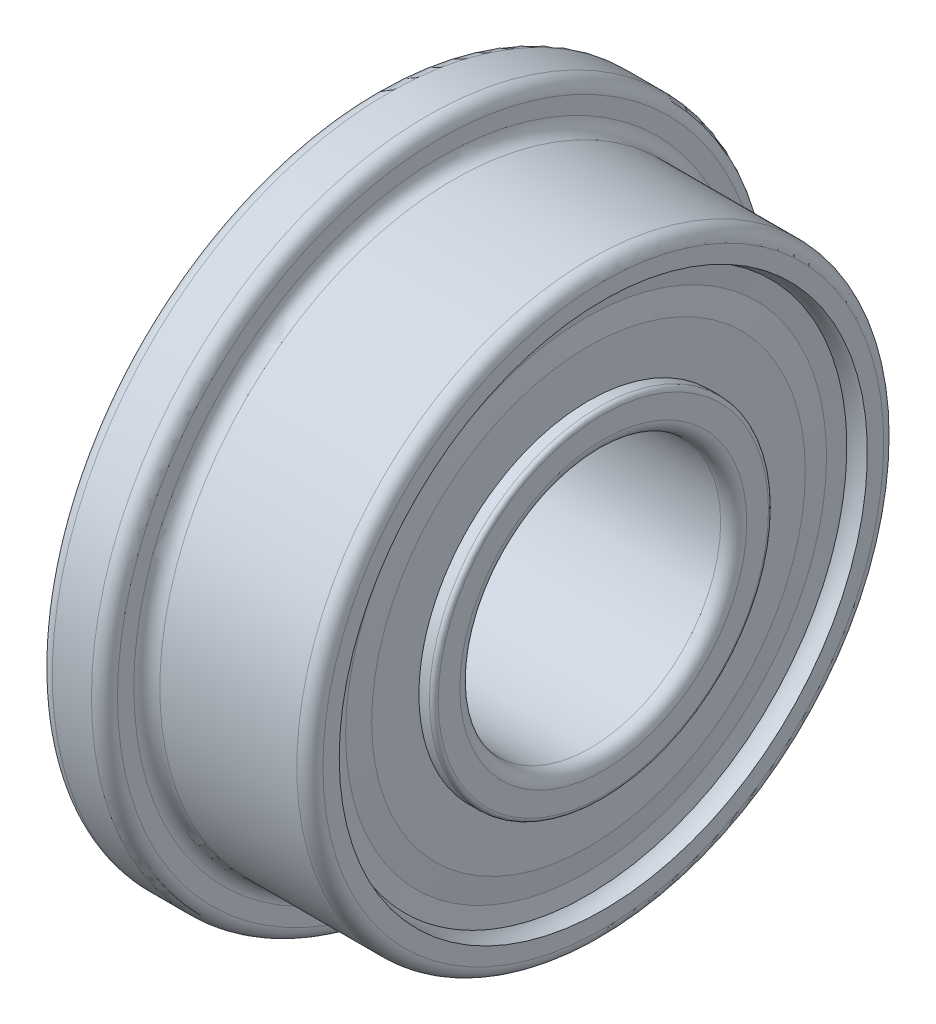
ISO-10303-21;
HEADER;
FILE_DESCRIPTION(('STEP AP214'),'2;1');
FILE_NAME('part.step','',(''),(''),'','','');
FILE_SCHEMA(('AUTOMOTIVE_DESIGN { 1 0 10303 214 1 1 1 1 }'));
ENDSEC;
DATA;
#1=APPLICATION_CONTEXT('core data for automotive mechanical design processes');
#2=APPLICATION_PROTOCOL_DEFINITION('international standard','automotive_design',2000,#1);
#3=PRODUCT_CONTEXT('',#1,'mechanical');
#4=PRODUCT('Part','Part','',(#3));
#5=PRODUCT_RELATED_PRODUCT_CATEGORY('part','',(#4));
#6=PRODUCT_DEFINITION_FORMATION('','',#4);
#7=PRODUCT_DEFINITION_CONTEXT('part definition',#1,'design');
#8=PRODUCT_DEFINITION('design','',#6,#7);
#9=PRODUCT_DEFINITION_SHAPE('','',#8);
#10=(LENGTH_UNIT() NAMED_UNIT(*) SI_UNIT(.MILLI.,.METRE.));
#11=(NAMED_UNIT(*) PLANE_ANGLE_UNIT() SI_UNIT($,.RADIAN.));
#12=(NAMED_UNIT(*) SI_UNIT($,.STERADIAN.) SOLID_ANGLE_UNIT());
#13=UNCERTAINTY_MEASURE_WITH_UNIT(LENGTH_MEASURE(1.E-05),#10,'distance_accuracy_value','');
#14=(GEOMETRIC_REPRESENTATION_CONTEXT(3) GLOBAL_UNCERTAINTY_ASSIGNED_CONTEXT((#13)) GLOBAL_UNIT_ASSIGNED_CONTEXT((#10,
#11,#12)) REPRESENTATION_CONTEXT('',''));
#15=CARTESIAN_POINT('',(0.,0.,0.));
#16=DIRECTION('',(0.,0.,1.));
#17=DIRECTION('',(1.,0.,0.));
#18=AXIS2_PLACEMENT_3D('',#15,#16,#17);
#19=CARTESIAN_POINT('',(1.75,1.97958012090148,-2.48231495683599));
#20=DIRECTION('',(1.,0.,0.));
#21=DIRECTION('',(0.,0.623489801858733,-0.78183148246803));
#22=AXIS2_PLACEMENT_3D('',#19,#20,#21);
#23=SPHERICAL_SURFACE('',#22,0.794);
#24=CARTESIAN_POINT('',(2.544,1.97958012090148,-2.48231495683599));
#25=VERTEX_POINT('',#24);
#26=VERTEX_LOOP('',#25);
#27=FACE_BOUND('',#26,.T.);
#28=CARTESIAN_POINT('',(0.956,1.97958012090148,-2.48231495683599));
#29=VERTEX_POINT('',#28);
#30=VERTEX_LOOP('',#29);
#31=FACE_BOUND('',#30,.T.);
#32=ADVANCED_FACE('P0_F15',(#27,#31),#23,.T.);
#33=CLOSED_SHELL('',(#32));
#34=MANIFOLD_SOLID_BREP('P0_B1',#33);
#35=CARTESIAN_POINT('',(1.75,0.,0.));
#36=DIRECTION('',(-1.,0.,0.));
#37=DIRECTION('',(0.,0.,1.));
#38=AXIS2_PLACEMENT_3D('',#35,#36,#37);
#39=TOROIDAL_SURFACE('',#38,3.175,0.794);
#40=CARTESIAN_POINT('',(1.2024500022829,0.,0.));
#41=DIRECTION('',(1.,0.,0.));
#42=DIRECTION('',(0.,0.,-1.));
#43=AXIS2_PLACEMENT_3D('',#40,#41,#42);
#44=CIRCLE('',#43,2.6);
#45=CARTESIAN_POINT('',(1.2024500022829,0.,-2.6));
#46=VERTEX_POINT('',#45);
#47=EDGE_CURVE('P1_E129',#46,#46,#44,.F.);
#48=ORIENTED_EDGE('',*,*,#47,.F.);
#49=EDGE_LOOP('',(#48));
#50=FACE_BOUND('',#49,.T.);
#51=CARTESIAN_POINT('',(2.2975499977171,0.,0.));
#52=DIRECTION('',(1.,0.,0.));
#53=DIRECTION('',(0.,0.,-1.));
#54=AXIS2_PLACEMENT_3D('',#51,#52,#53);
#55=CIRCLE('',#54,2.6);
#56=CARTESIAN_POINT('',(2.2975499977171,0.,-2.6));
#57=VERTEX_POINT('',#56);
#58=EDGE_CURVE('P1_E124',#57,#57,#55,.T.);
#59=ORIENTED_EDGE('',*,*,#58,.F.);
#60=EDGE_LOOP('',(#59));
#61=FACE_BOUND('',#60,.T.);
#62=ADVANCED_FACE('P1_F16',(#50,#61),#39,.F.);
#63=CARTESIAN_POINT('',(0.634725001141448,0.,0.));
#64=DIRECTION('',(1.,0.,0.));
#65=DIRECTION('',(0.,0.,-1.));
#66=AXIS2_PLACEMENT_3D('',#63,#64,#65);
#67=CYLINDRICAL_SURFACE('',#66,2.6);
#68=ORIENTED_EDGE('',*,*,#47,.T.);
#69=EDGE_LOOP('',(#68));
#70=FACE_BOUND('',#69,.T.);
#71=CARTESIAN_POINT('',(0.0670000000000001,0.,0.));
#72=DIRECTION('',(-1.,0.,0.));
#73=DIRECTION('',(0.,0.,1.));
#74=AXIS2_PLACEMENT_3D('',#71,#72,#73);
#75=CIRCLE('',#74,2.6);
#76=CARTESIAN_POINT('',(0.0670000000000001,0.,2.6));
#77=VERTEX_POINT('',#76);
#78=EDGE_CURVE('P1_E122',#77,#77,#75,.T.);
#79=ORIENTED_EDGE('',*,*,#78,.F.);
#80=EDGE_LOOP('',(#79));
#81=FACE_BOUND('',#80,.T.);
#82=ADVANCED_FACE('P1_F358',(#70,#81),#67,.T.);
#83=CARTESIAN_POINT('',(2.86527499885855,0.,0.));
#84=DIRECTION('',(1.,0.,0.));
#85=DIRECTION('',(0.,0.,-1.));
#86=AXIS2_PLACEMENT_3D('',#83,#84,#85);
#87=CYLINDRICAL_SURFACE('',#86,2.6);
#88=CARTESIAN_POINT('',(3.433,0.,0.));
#89=DIRECTION('',(-1.,0.,0.));
#90=DIRECTION('',(0.,0.,1.));
#91=AXIS2_PLACEMENT_3D('',#88,#89,#90);
#92=CIRCLE('',#91,2.6);
#93=CARTESIAN_POINT('',(3.433,0.,2.6));
#94=VERTEX_POINT('',#93);
#95=EDGE_CURVE('P1_E114',#94,#94,#92,.F.);
#96=ORIENTED_EDGE('',*,*,#95,.F.);
#97=EDGE_LOOP('',(#96));
#98=FACE_BOUND('',#97,.T.);
#99=ORIENTED_EDGE('',*,*,#58,.T.);
#100=EDGE_LOOP('',(#99));
#101=FACE_BOUND('',#100,.T.);
#102=ADVANCED_FACE('P1_F104',(#98,#101),#87,.T.);
#103=CARTESIAN_POINT('',(0.0670000000000001,0.,0.));
#104=DIRECTION('',(-1.,0.,0.));
#105=DIRECTION('',(0.,0.,1.));
#106=AXIS2_PLACEMENT_3D('',#103,#104,#105);
#107=TOROIDAL_SURFACE('',#106,2.533,0.0670000000000002);
#108=ORIENTED_EDGE('',*,*,#78,.T.);
#109=EDGE_LOOP('',(#108));
#110=FACE_BOUND('',#109,.T.);
#111=CARTESIAN_POINT('',(0.,0.,0.));
#112=DIRECTION('',(1.,0.,0.));
#113=DIRECTION('',(0.,0.,-1.));
#114=AXIS2_PLACEMENT_3D('',#111,#112,#113);
#115=CIRCLE('',#114,2.533);
#116=CARTESIAN_POINT('',(0.,2.533,0.));
#117=VERTEX_POINT('',#116);
#118=CARTESIAN_POINT('',(0.,0.,-2.533));
#119=VERTEX_POINT('',#118);
#120=EDGE_CURVE('P1_E70',#117,#119,#115,.F.);
#121=ORIENTED_EDGE('',*,*,#120,.F.);
#122=CARTESIAN_POINT('',(0.,0.,0.));
#123=DIRECTION('',(1.,0.,0.));
#124=DIRECTION('',(0.,1.,0.));
#125=AXIS2_PLACEMENT_3D('',#122,#123,#124);
#126=CIRCLE('',#125,2.533);
#127=CARTESIAN_POINT('',(0.,0.,2.533));
#128=VERTEX_POINT('',#127);
#129=EDGE_CURVE('P1_E78',#128,#117,#126,.F.);
#130=ORIENTED_EDGE('',*,*,#129,.F.);
#131=CARTESIAN_POINT('',(0.,0.,0.));
#132=DIRECTION('',(1.,0.,0.));
#133=DIRECTION('',(0.,0.,1.));
#134=AXIS2_PLACEMENT_3D('',#131,#132,#133);
#135=CIRCLE('',#134,2.533);
#136=EDGE_CURVE('P1_E73',#119,#128,#135,.F.);
#137=ORIENTED_EDGE('',*,*,#136,.F.);
#138=EDGE_LOOP('',(#121,#130,#137));
#139=FACE_BOUND('',#138,.T.);
#140=ADVANCED_FACE('P1_F84',(#110,#139),#107,.T.);
#141=CARTESIAN_POINT('',(3.433,0.,0.));
#142=DIRECTION('',(-1.,0.,0.));
#143=DIRECTION('',(0.,0.,1.));
#144=AXIS2_PLACEMENT_3D('',#141,#142,#143);
#145=TOROIDAL_SURFACE('',#144,2.533,0.0670000000000002);
#146=ORIENTED_EDGE('',*,*,#95,.T.);
#147=EDGE_LOOP('',(#146));
#148=FACE_BOUND('',#147,.T.);
#149=CARTESIAN_POINT('',(3.5,0.,0.));
#150=DIRECTION('',(-1.,0.,0.));
#151=DIRECTION('',(0.,0.,-1.));
#152=AXIS2_PLACEMENT_3D('',#149,#150,#151);
#153=CIRCLE('',#152,2.533);
#154=CARTESIAN_POINT('',(3.5,0.,2.533));
#155=VERTEX_POINT('',#154);
#156=CARTESIAN_POINT('',(3.5,0.,-2.533));
#157=VERTEX_POINT('',#156);
#158=EDGE_CURVE('P1_E273',#155,#157,#153,.F.);
#159=ORIENTED_EDGE('',*,*,#158,.F.);
#160=CARTESIAN_POINT('',(3.5,0.,0.));
#161=DIRECTION('',(-1.,0.,0.));
#162=DIRECTION('',(0.,0.,1.));
#163=AXIS2_PLACEMENT_3D('',#160,#161,#162);
#164=CIRCLE('',#163,2.533);
#165=CARTESIAN_POINT('',(3.5,2.533,0.));
#166=VERTEX_POINT('',#165);
#167=EDGE_CURVE('P1_E274',#166,#155,#164,.F.);
#168=ORIENTED_EDGE('',*,*,#167,.F.);
#169=CARTESIAN_POINT('',(3.5,0.,0.));
#170=DIRECTION('',(-1.,0.,0.));
#171=DIRECTION('',(0.,1.,0.));
#172=AXIS2_PLACEMENT_3D('',#169,#170,#171);
#173=CIRCLE('',#172,2.533);
#174=EDGE_CURVE('P1_E86',#157,#166,#173,.F.);
#175=ORIENTED_EDGE('',*,*,#174,.F.);
#176=EDGE_LOOP('',(#159,#168,#175));
#177=FACE_BOUND('',#176,.T.);
#178=ADVANCED_FACE('P1_F103',(#148,#177),#145,.T.);
#179=CARTESIAN_POINT('',(0.,2.3665,0.));
#180=DIRECTION('',(-1.,0.,0.));
#181=DIRECTION('',(0.,-1.,0.));
#182=AXIS2_PLACEMENT_3D('',#179,#180,#181);
#183=PLANE('',#182);
#184=ORIENTED_EDGE('',*,*,#136,.T.);
#185=ORIENTED_EDGE('',*,*,#129,.T.);
#186=ORIENTED_EDGE('',*,*,#120,.T.);
#187=EDGE_LOOP('',(#184,#185,#186));
#188=FACE_BOUND('',#187,.T.);
#189=CARTESIAN_POINT('',(0.,0.,0.));
#190=DIRECTION('',(-1.,0.,0.));
#191=DIRECTION('',(0.,0.,1.));
#192=AXIS2_PLACEMENT_3D('',#189,#190,#191);
#193=CIRCLE('',#192,2.2);
#194=CARTESIAN_POINT('',(0.,0.,2.2));
#195=VERTEX_POINT('',#194);
#196=CARTESIAN_POINT('',(0.,2.2,0.));
#197=VERTEX_POINT('',#196);
#198=EDGE_CURVE('P1_E244',#195,#197,#193,.T.);
#199=ORIENTED_EDGE('',*,*,#198,.F.);
#200=CARTESIAN_POINT('',(0.,0.,0.));
#201=DIRECTION('',(-1.,0.,0.));
#202=DIRECTION('',(0.,0.,-1.));
#203=AXIS2_PLACEMENT_3D('',#200,#201,#202);
#204=CIRCLE('',#203,2.2);
#205=CARTESIAN_POINT('',(0.,0.,-2.2));
#206=VERTEX_POINT('',#205);
#207=EDGE_CURVE('P1_E255',#206,#195,#204,.T.);
#208=ORIENTED_EDGE('',*,*,#207,.F.);
#209=CARTESIAN_POINT('',(0.,0.,0.));
#210=DIRECTION('',(-1.,0.,0.));
#211=DIRECTION('',(0.,1.,0.));
#212=AXIS2_PLACEMENT_3D('',#209,#210,#211);
#213=CIRCLE('',#212,2.2);
#214=EDGE_CURVE('P1_E234',#197,#206,#213,.T.);
#215=ORIENTED_EDGE('',*,*,#214,.F.);
#216=EDGE_LOOP('',(#199,#208,#215));
#217=FACE_BOUND('',#216,.T.);
#218=ADVANCED_FACE('P1_F76',(#188,#217),#183,.T.);
#219=CARTESIAN_POINT('',(3.5,2.3665,0.));
#220=DIRECTION('',(1.,0.,0.));
#221=DIRECTION('',(0.,1.,0.));
#222=AXIS2_PLACEMENT_3D('',#219,#220,#221);
#223=PLANE('',#222);
#224=CARTESIAN_POINT('',(3.5,0.,0.));
#225=DIRECTION('',(1.,0.,0.));
#226=DIRECTION('',(0.,0.,1.));
#227=AXIS2_PLACEMENT_3D('',#224,#225,#226);
#228=CIRCLE('',#227,2.2);
#229=CARTESIAN_POINT('',(3.5,0.,2.2));
#230=VERTEX_POINT('',#229);
#231=CARTESIAN_POINT('',(3.5,0.,-2.2));
#232=VERTEX_POINT('',#231);
#233=EDGE_CURVE('P1_E133',#230,#232,#228,.T.);
#234=ORIENTED_EDGE('',*,*,#233,.F.);
#235=CARTESIAN_POINT('',(3.5,0.,0.));
#236=DIRECTION('',(1.,0.,0.));
#237=DIRECTION('',(0.,1.,0.));
#238=AXIS2_PLACEMENT_3D('',#235,#236,#237);
#239=CIRCLE('',#238,2.2);
#240=CARTESIAN_POINT('',(3.5,2.2,0.));
#241=VERTEX_POINT('',#240);
#242=EDGE_CURVE('P1_E206',#241,#230,#239,.T.);
#243=ORIENTED_EDGE('',*,*,#242,.F.);
#244=CARTESIAN_POINT('',(3.5,0.,0.));
#245=DIRECTION('',(1.,0.,0.));
#246=DIRECTION('',(0.,0.,-1.));
#247=AXIS2_PLACEMENT_3D('',#244,#245,#246);
#248=CIRCLE('',#247,2.2);
#249=EDGE_CURVE('P1_E37',#232,#241,#248,.T.);
#250=ORIENTED_EDGE('',*,*,#249,.F.);
#251=EDGE_LOOP('',(#234,#243,#250));
#252=FACE_BOUND('',#251,.T.);
#253=ORIENTED_EDGE('',*,*,#167,.T.);
#254=ORIENTED_EDGE('',*,*,#158,.T.);
#255=ORIENTED_EDGE('',*,*,#174,.T.);
#256=EDGE_LOOP('',(#253,#254,#255));
#257=FACE_BOUND('',#256,.T.);
#258=ADVANCED_FACE('P1_F170',(#252,#257),#223,.T.);
#259=CARTESIAN_POINT('',(0.2,0.,0.));
#260=DIRECTION('',(-1.,0.,0.));
#261=DIRECTION('',(0.,0.,1.));
#262=AXIS2_PLACEMENT_3D('',#259,#260,#261);
#263=TOROIDAL_SURFACE('',#262,2.2,0.2);
#264=CARTESIAN_POINT('',(0.2,0.,0.));
#265=DIRECTION('',(1.,0.,0.));
#266=DIRECTION('',(0.,0.,-1.));
#267=AXIS2_PLACEMENT_3D('',#264,#265,#266);
#268=CIRCLE('',#267,2.);
#269=CARTESIAN_POINT('',(0.2,0.,-2.));
#270=VERTEX_POINT('',#269);
#271=EDGE_CURVE('P1_E28',#270,#270,#268,.T.);
#272=ORIENTED_EDGE('',*,*,#271,.T.);
#273=EDGE_LOOP('',(#272));
#274=FACE_BOUND('',#273,.T.);
#275=ORIENTED_EDGE('',*,*,#207,.T.);
#276=ORIENTED_EDGE('',*,*,#198,.T.);
#277=ORIENTED_EDGE('',*,*,#214,.T.);
#278=EDGE_LOOP('',(#275,#276,#277));
#279=FACE_BOUND('',#278,.T.);
#280=ADVANCED_FACE('P1_F151',(#274,#279),#263,.T.);
#281=CARTESIAN_POINT('',(3.3,0.,0.));
#282=DIRECTION('',(-1.,0.,0.));
#283=DIRECTION('',(0.,0.,1.));
#284=AXIS2_PLACEMENT_3D('',#281,#282,#283);
#285=TOROIDAL_SURFACE('',#284,2.2,0.2);
#286=CARTESIAN_POINT('',(3.3,0.,0.));
#287=DIRECTION('',(1.,0.,0.));
#288=DIRECTION('',(0.,0.,-1.));
#289=AXIS2_PLACEMENT_3D('',#286,#287,#288);
#290=CIRCLE('',#289,2.);
#291=CARTESIAN_POINT('',(3.3,0.,-2.));
#292=VERTEX_POINT('',#291);
#293=EDGE_CURVE('P1_E11',#292,#292,#290,.F.);
#294=ORIENTED_EDGE('',*,*,#293,.T.);
#295=EDGE_LOOP('',(#294));
#296=FACE_BOUND('',#295,.T.);
#297=ORIENTED_EDGE('',*,*,#249,.T.);
#298=ORIENTED_EDGE('',*,*,#242,.T.);
#299=ORIENTED_EDGE('',*,*,#233,.T.);
#300=EDGE_LOOP('',(#297,#298,#299));
#301=FACE_BOUND('',#300,.T.);
#302=ADVANCED_FACE('P1_F139',(#296,#301),#285,.T.);
#303=CARTESIAN_POINT('',(1.75,0.,0.));
#304=DIRECTION('',(1.,0.,0.));
#305=DIRECTION('',(0.,0.,-1.));
#306=AXIS2_PLACEMENT_3D('',#303,#304,#305);
#307=CYLINDRICAL_SURFACE('',#306,2.);
#308=ORIENTED_EDGE('',*,*,#293,.F.);
#309=EDGE_LOOP('',(#308));
#310=FACE_BOUND('',#309,.T.);
#311=ORIENTED_EDGE('',*,*,#271,.F.);
#312=EDGE_LOOP('',(#311));
#313=FACE_BOUND('',#312,.T.);
#314=ADVANCED_FACE('P1_F150',(#310,#313),#307,.F.);
#315=CLOSED_SHELL('',(#62,#82,#102,#140,#178,#218,#258,#280,#302,#314));
#316=MANIFOLD_SOLID_BREP('P1_B1',#315);
#317=CARTESIAN_POINT('',(0.302499999989436,0.,0.));
#318=DIRECTION('',(-1.,0.,0.));
#319=DIRECTION('',(0.,0.,1.));
#320=AXIS2_PLACEMENT_3D('',#317,#318,#319);
#321=CONICAL_SURFACE('',#320,4.05000000006339,1.37175391078244);
#322=CARTESIAN_POINT('',(0.3025,0.,0.));
#323=DIRECTION('',(1.,0.,0.));
#324=DIRECTION('',(0.,0.,-1.));
#325=AXIS2_PLACEMENT_3D('',#322,#323,#324);
#326=CIRCLE('',#325,4.05);
#327=CARTESIAN_POINT('',(0.3025,0.,-4.05));
#328=VERTEX_POINT('',#327);
#329=EDGE_CURVE('P2_E29',#328,#328,#326,.F.);
#330=ORIENTED_EDGE('',*,*,#329,.F.);
#331=EDGE_LOOP('',(#330));
#332=FACE_BOUND('',#331,.T.);
#333=CARTESIAN_POINT('',(0.378000000009235,0.,0.));
#334=DIRECTION('',(-1.,0.,0.));
#335=DIRECTION('',(0.,0.,1.));
#336=AXIS2_PLACEMENT_3D('',#333,#334,#335);
#337=CIRCLE('',#336,3.67570637928338);
#338=CARTESIAN_POINT('',(0.378000000009235,0.,3.67570637928338));
#339=VERTEX_POINT('',#338);
#340=EDGE_CURVE('P2_E17',#339,#339,#337,.F.);
#341=ORIENTED_EDGE('',*,*,#340,.F.);
#342=EDGE_LOOP('',(#341));
#343=FACE_BOUND('',#342,.T.);
#344=ADVANCED_FACE('P2_F14',(#332,#343),#321,.T.);
#345=CARTESIAN_POINT('',(0.378,3.50035318965517,0.));
#346=DIRECTION('',(1.,0.,0.));
#347=DIRECTION('',(0.,0.,-1.));
#348=AXIS2_PLACEMENT_3D('',#345,#346,#347);
#349=PLANE('',#348);
#350=CARTESIAN_POINT('',(0.377999999994211,0.,0.));
#351=DIRECTION('',(1.,0.,0.));
#352=DIRECTION('',(0.,0.,-1.));
#353=AXIS2_PLACEMENT_3D('',#350,#351,#352);
#354=CIRCLE('',#353,3.32500000001801);
#355=CARTESIAN_POINT('',(0.377999999994211,0.,-3.32500000001801));
#356=VERTEX_POINT('',#355);
#357=EDGE_CURVE('P2_E31',#356,#356,#354,.F.);
#358=ORIENTED_EDGE('',*,*,#357,.T.);
#359=EDGE_LOOP('',(#358));
#360=FACE_BOUND('',#359,.T.);
#361=ORIENTED_EDGE('',*,*,#340,.T.);
#362=EDGE_LOOP('',(#361));
#363=FACE_BOUND('',#362,.T.);
#364=ADVANCED_FACE('P2_F44',(#360,#363),#349,.T.);
#365=CARTESIAN_POINT('',(0.26475,0.,0.));
#366=DIRECTION('',(1.,0.,0.));
#367=DIRECTION('',(0.,0.,-1.));
#368=AXIS2_PLACEMENT_3D('',#365,#366,#367);
#369=CYLINDRICAL_SURFACE('',#368,4.05);
#370=CARTESIAN_POINT('',(0.226999999995314,0.,0.));
#371=DIRECTION('',(-1.,0.,0.));
#372=DIRECTION('',(0.,1.,0.));
#373=AXIS2_PLACEMENT_3D('',#370,#371,#372);
#374=CIRCLE('',#373,4.05000000000655);
#375=CARTESIAN_POINT('',(0.226999999995314,4.05000000000655,0.));
#376=VERTEX_POINT('',#375);
#377=EDGE_CURVE('P2_E33',#376,#376,#374,.F.);
#378=ORIENTED_EDGE('',*,*,#377,.T.);
#379=EDGE_LOOP('',(#378));
#380=FACE_BOUND('',#379,.T.);
#381=ORIENTED_EDGE('',*,*,#329,.T.);
#382=EDGE_LOOP('',(#381));
#383=FACE_BOUND('',#382,.T.);
#384=ADVANCED_FACE('P2_F52',(#380,#383),#369,.T.);
#385=CARTESIAN_POINT('',(0.377999999976453,0.,0.));
#386=DIRECTION('',(1.,0.,0.));
#387=DIRECTION('',(0.,0.,-1.));
#388=AXIS2_PLACEMENT_3D('',#385,#386,#387);
#389=CONICAL_SURFACE('',#388,3.32499999984748,1.46703241359791);
#390=ORIENTED_EDGE('',*,*,#357,.F.);
#391=EDGE_LOOP('',(#390));
#392=FACE_BOUND('',#391,.T.);
#393=CARTESIAN_POINT('',(0.3025,0.,0.));
#394=DIRECTION('',(1.,0.,0.));
#395=DIRECTION('',(0.,0.,-1.));
#396=AXIS2_PLACEMENT_3D('',#393,#394,#395);
#397=CIRCLE('',#396,2.6);
#398=CARTESIAN_POINT('',(0.3025,0.,-2.6));
#399=VERTEX_POINT('',#398);
#400=EDGE_CURVE('P2_E37',#399,#399,#397,.F.);
#401=ORIENTED_EDGE('',*,*,#400,.T.);
#402=EDGE_LOOP('',(#401));
#403=FACE_BOUND('',#402,.T.);
#404=ADVANCED_FACE('P2_F71',(#392,#403),#389,.F.);
#405=CARTESIAN_POINT('',(0.227000000016631,0.,0.));
#406=DIRECTION('',(-1.,0.,0.));
#407=DIRECTION('',(0.,0.,1.));
#408=AXIS2_PLACEMENT_3D('',#405,#406,#407);
#409=CONICAL_SURFACE('',#408,4.04999999983602,1.46703241360275);
#410=CARTESIAN_POINT('',(0.264749999992375,0.,0.));
#411=DIRECTION('',(1.,0.,0.));
#412=DIRECTION('',(0.,1.,0.));
#413=AXIS2_PLACEMENT_3D('',#410,#411,#412);
#414=CIRCLE('',#413,3.68750000001228);
#415=CARTESIAN_POINT('',(0.264749999992375,3.68750000001228,0.));
#416=VERTEX_POINT('',#415);
#417=EDGE_CURVE('P2_E26',#416,#416,#414,.F.);
#418=ORIENTED_EDGE('',*,*,#417,.F.);
#419=EDGE_LOOP('',(#418));
#420=FACE_BOUND('',#419,.T.);
#421=ORIENTED_EDGE('',*,*,#377,.F.);
#422=EDGE_LOOP('',(#421));
#423=FACE_BOUND('',#422,.T.);
#424=ADVANCED_FACE('P2_F67',(#420,#423),#409,.F.);
#425=CARTESIAN_POINT('',(0.26475,0.,0.));
#426=DIRECTION('',(1.,0.,0.));
#427=DIRECTION('',(0.,0.,-1.));
#428=AXIS2_PLACEMENT_3D('',#425,#426,#427);
#429=CYLINDRICAL_SURFACE('',#428,2.6);
#430=ORIENTED_EDGE('',*,*,#400,.F.);
#431=EDGE_LOOP('',(#430));
#432=FACE_BOUND('',#431,.T.);
#433=CARTESIAN_POINT('',(0.227,0.,0.));
#434=DIRECTION('',(1.,0.,0.));
#435=DIRECTION('',(0.,0.,-1.));
#436=AXIS2_PLACEMENT_3D('',#433,#434,#435);
#437=CIRCLE('',#436,2.6);
#438=CARTESIAN_POINT('',(0.227,0.,-2.6));
#439=VERTEX_POINT('',#438);
#440=EDGE_CURVE('P2_E21',#439,#439,#437,.T.);
#441=ORIENTED_EDGE('',*,*,#440,.F.);
#442=EDGE_LOOP('',(#441));
#443=FACE_BOUND('',#442,.T.);
#444=ADVANCED_FACE('P2_F60',(#432,#443),#429,.F.);
#445=CARTESIAN_POINT('',(0.264749999971059,0.,0.));
#446=DIRECTION('',(1.,0.,0.));
#447=DIRECTION('',(0.,0.,-1.));
#448=AXIS2_PLACEMENT_3D('',#445,#446,#447);
#449=CONICAL_SURFACE('',#448,3.6874999997849,1.46703241360922);
#450=CARTESIAN_POINT('',(0.226999999998862,0.,0.));
#451=DIRECTION('',(1.,0.,0.));
#452=DIRECTION('',(0.,0.,-1.));
#453=AXIS2_PLACEMENT_3D('',#450,#451,#452);
#454=CIRCLE('',#453,3.32500000001801);
#455=CARTESIAN_POINT('',(0.226999999998862,0.,-3.32500000001801));
#456=VERTEX_POINT('',#455);
#457=EDGE_CURVE('P2_E10',#456,#456,#454,.F.);
#458=ORIENTED_EDGE('',*,*,#457,.F.);
#459=EDGE_LOOP('',(#458));
#460=FACE_BOUND('',#459,.T.);
#461=ORIENTED_EDGE('',*,*,#417,.T.);
#462=EDGE_LOOP('',(#461));
#463=FACE_BOUND('',#462,.T.);
#464=ADVANCED_FACE('P2_F55',(#460,#463),#449,.T.);
#465=CARTESIAN_POINT('',(0.227,2.9625,0.));
#466=DIRECTION('',(-1.,0.,0.));
#467=DIRECTION('',(0.,0.,1.));
#468=AXIS2_PLACEMENT_3D('',#465,#466,#467);
#469=PLANE('',#468);
#470=ORIENTED_EDGE('',*,*,#457,.T.);
#471=EDGE_LOOP('',(#470));
#472=FACE_BOUND('',#471,.T.);
#473=ORIENTED_EDGE('',*,*,#440,.T.);
#474=EDGE_LOOP('',(#473));
#475=FACE_BOUND('',#474,.T.);
#476=ADVANCED_FACE('P2_F53',(#472,#475),#469,.T.);
#477=CLOSED_SHELL('',(#344,#364,#384,#404,#424,#444,#464,#476));
#478=MANIFOLD_SOLID_BREP('P2_B1',#477);
#479=CARTESIAN_POINT('',(1.75,-0.706503965311296,3.09539612117729));
#480=DIRECTION('',(1.,0.,0.));
#481=DIRECTION('',(0.,-0.222520933956314,0.974927912181824));
#482=AXIS2_PLACEMENT_3D('',#479,#480,#481);
#483=SPHERICAL_SURFACE('',#482,0.794);
#484=CARTESIAN_POINT('',(2.544,-0.706503965311296,3.09539612117729));
#485=VERTEX_POINT('',#484);
#486=VERTEX_LOOP('',#485);
#487=FACE_BOUND('',#486,.T.);
#488=CARTESIAN_POINT('',(0.956,-0.706503965311296,3.09539612117729));
#489=VERTEX_POINT('',#488);
#490=VERTEX_LOOP('',#489);
#491=FACE_BOUND('',#490,.T.);
#492=ADVANCED_FACE('P3_F15',(#487,#491),#483,.T.);
#493=CLOSED_SHELL('',(#492));
#494=MANIFOLD_SOLID_BREP('P3_B1',#493);
#495=CARTESIAN_POINT('',(1.75,1.97958012090148,2.482314956836));
#496=DIRECTION('',(1.,0.,0.));
#497=DIRECTION('',(0.,0.623489801858733,0.78183148246803));
#498=AXIS2_PLACEMENT_3D('',#495,#496,#497);
#499=SPHERICAL_SURFACE('',#498,0.794);
#500=CARTESIAN_POINT('',(2.544,1.97958012090148,2.482314956836));
#501=VERTEX_POINT('',#500);
#502=VERTEX_LOOP('',#501);
#503=FACE_BOUND('',#502,.T.);
#504=CARTESIAN_POINT('',(0.956,1.97958012090148,2.482314956836));
#505=VERTEX_POINT('',#504);
#506=VERTEX_LOOP('',#505);
#507=FACE_BOUND('',#506,.T.);
#508=ADVANCED_FACE('P4_F15',(#503,#507),#499,.T.);
#509=CLOSED_SHELL('',(#508));
#510=MANIFOLD_SOLID_BREP('P4_B1',#509);
#511=CARTESIAN_POINT('',(1.75,-2.86057615559018,1.37758087169825));
#512=DIRECTION('',(1.,0.,0.));
#513=DIRECTION('',(0.,-0.900968867902419,0.433883739117558));
#514=AXIS2_PLACEMENT_3D('',#511,#512,#513);
#515=SPHERICAL_SURFACE('',#514,0.794);
#516=CARTESIAN_POINT('',(2.544,-2.86057615559018,1.37758087169825));
#517=VERTEX_POINT('',#516);
#518=VERTEX_LOOP('',#517);
#519=FACE_BOUND('',#518,.T.);
#520=CARTESIAN_POINT('',(0.956,-2.86057615559018,1.37758087169825));
#521=VERTEX_POINT('',#520);
#522=VERTEX_LOOP('',#521);
#523=FACE_BOUND('',#522,.T.);
#524=ADVANCED_FACE('P5_F15',(#519,#523),#515,.T.);
#525=CLOSED_SHELL('',(#524));
#526=MANIFOLD_SOLID_BREP('P5_B1',#525);
#527=CARTESIAN_POINT('',(1.75,-0.706503965311298,-3.09539612117729));
#528=DIRECTION('',(1.,0.,0.));
#529=DIRECTION('',(0.,-0.222520933956314,-0.974927912181824));
#530=AXIS2_PLACEMENT_3D('',#527,#528,#529);
#531=SPHERICAL_SURFACE('',#530,0.794);
#532=CARTESIAN_POINT('',(2.544,-0.706503965311298,-3.09539612117729));
#533=VERTEX_POINT('',#532);
#534=VERTEX_LOOP('',#533);
#535=FACE_BOUND('',#534,.T.);
#536=CARTESIAN_POINT('',(0.956,-0.706503965311298,-3.09539612117729));
#537=VERTEX_POINT('',#536);
#538=VERTEX_LOOP('',#537);
#539=FACE_BOUND('',#538,.T.);
#540=ADVANCED_FACE('P6_F15',(#535,#539),#531,.T.);
#541=CLOSED_SHELL('',(#540));
#542=MANIFOLD_SOLID_BREP('P6_B1',#541);
#543=CARTESIAN_POINT('',(3.19749999999885,0.,0.));
#544=DIRECTION('',(1.,0.,0.));
#545=DIRECTION('',(0.,0.,-1.));
#546=AXIS2_PLACEMENT_3D('',#543,#544,#545);
#547=CONICAL_SURFACE('',#546,4.05000000006339,1.37175391078244);
#548=CARTESIAN_POINT('',(3.12199999997906,0.,0.));
#549=DIRECTION('',(1.,0.,0.));
#550=DIRECTION('',(0.,0.,-1.));
#551=AXIS2_PLACEMENT_3D('',#548,#549,#550);
#552=CIRCLE('',#551,3.67570637928338);
#553=CARTESIAN_POINT('',(3.12199999997906,0.,-3.67570637928338));
#554=VERTEX_POINT('',#553);
#555=EDGE_CURVE('P7_E17',#554,#554,#552,.F.);
#556=ORIENTED_EDGE('',*,*,#555,.F.);
#557=EDGE_LOOP('',(#556));
#558=FACE_BOUND('',#557,.T.);
#559=CARTESIAN_POINT('',(3.1975,0.,0.));
#560=DIRECTION('',(1.,0.,0.));
#561=DIRECTION('',(0.,0.,-1.));
#562=AXIS2_PLACEMENT_3D('',#559,#560,#561);
#563=CIRCLE('',#562,4.05);
#564=CARTESIAN_POINT('',(3.1975,0.,-4.05));
#565=VERTEX_POINT('',#564);
#566=EDGE_CURVE('P7_E29',#565,#565,#563,.T.);
#567=ORIENTED_EDGE('',*,*,#566,.F.);
#568=EDGE_LOOP('',(#567));
#569=FACE_BOUND('',#568,.T.);
#570=ADVANCED_FACE('P7_F14',(#558,#569),#547,.T.);
#571=CARTESIAN_POINT('',(3.23525,0.,0.));
#572=DIRECTION('',(1.,0.,0.));
#573=DIRECTION('',(0.,0.,-1.));
#574=AXIS2_PLACEMENT_3D('',#571,#572,#573);
#575=CYLINDRICAL_SURFACE('',#574,4.05);
#576=ORIENTED_EDGE('',*,*,#566,.T.);
#577=EDGE_LOOP('',(#576));
#578=FACE_BOUND('',#577,.T.);
#579=CARTESIAN_POINT('',(3.27300000000008,0.,0.));
#580=DIRECTION('',(1.,0.,0.));
#581=DIRECTION('',(0.,1.,0.));
#582=AXIS2_PLACEMENT_3D('',#579,#580,#581);
#583=CIRCLE('',#582,4.05000000000655);
#584=CARTESIAN_POINT('',(3.27300000000008,4.05000000000655,0.));
#585=VERTEX_POINT('',#584);
#586=EDGE_CURVE('P7_E34',#585,#585,#583,.F.);
#587=ORIENTED_EDGE('',*,*,#586,.T.);
#588=EDGE_LOOP('',(#587));
#589=FACE_BOUND('',#588,.T.);
#590=ADVANCED_FACE('P7_F73',(#578,#589),#575,.T.);
#591=CARTESIAN_POINT('',(3.122,3.50035318965517,0.));
#592=DIRECTION('',(-1.,0.,0.));
#593=DIRECTION('',(0.,0.,1.));
#594=AXIS2_PLACEMENT_3D('',#591,#592,#593);
#595=PLANE('',#594);
#596=ORIENTED_EDGE('',*,*,#555,.T.);
#597=EDGE_LOOP('',(#596));
#598=FACE_BOUND('',#597,.T.);
#599=CARTESIAN_POINT('',(3.12200000000118,0.,0.));
#600=DIRECTION('',(-1.,0.,0.));
#601=DIRECTION('',(0.,0.,1.));
#602=AXIS2_PLACEMENT_3D('',#599,#600,#601);
#603=CIRCLE('',#602,3.32500000001801);
#604=CARTESIAN_POINT('',(3.12200000000118,0.,3.32500000001801));
#605=VERTEX_POINT('',#604);
#606=EDGE_CURVE('P7_E31',#605,#605,#603,.F.);
#607=ORIENTED_EDGE('',*,*,#606,.T.);
#608=EDGE_LOOP('',(#607));
#609=FACE_BOUND('',#608,.T.);
#610=ADVANCED_FACE('P7_F70',(#598,#609),#595,.T.);
#611=CARTESIAN_POINT('',(3.27299999997877,0.,0.));
#612=DIRECTION('',(1.,0.,0.));
#613=DIRECTION('',(0.,0.,-1.));
#614=AXIS2_PLACEMENT_3D('',#611,#612,#613);
#615=CONICAL_SURFACE('',#614,4.04999999983602,1.46703241360275);
#616=ORIENTED_EDGE('',*,*,#586,.F.);
#617=EDGE_LOOP('',(#616));
#618=FACE_BOUND('',#617,.T.);
#619=CARTESIAN_POINT('',(3.23525000000302,0.,0.));
#620=DIRECTION('',(-1.,0.,0.));
#621=DIRECTION('',(0.,1.,0.));
#622=AXIS2_PLACEMENT_3D('',#619,#620,#621);
#623=CIRCLE('',#622,3.68750000001228);
#624=CARTESIAN_POINT('',(3.23525000000302,3.68750000001228,0.));
#625=VERTEX_POINT('',#624);
#626=EDGE_CURVE('P7_E33',#625,#625,#623,.F.);
#627=ORIENTED_EDGE('',*,*,#626,.F.);
#628=EDGE_LOOP('',(#627));
#629=FACE_BOUND('',#628,.T.);
#630=ADVANCED_FACE('P7_F67',(#618,#629),#615,.F.);
#631=CARTESIAN_POINT('',(3.12200000001894,0.,0.));
#632=DIRECTION('',(-1.,0.,0.));
#633=DIRECTION('',(0.,0.,1.));
#634=AXIS2_PLACEMENT_3D('',#631,#632,#633);
#635=CONICAL_SURFACE('',#634,3.32499999984748,1.46703241359791);
#636=CARTESIAN_POINT('',(3.1975,0.,0.));
#637=DIRECTION('',(1.,0.,0.));
#638=DIRECTION('',(0.,0.,-1.));
#639=AXIS2_PLACEMENT_3D('',#636,#637,#638);
#640=CIRCLE('',#639,2.6);
#641=CARTESIAN_POINT('',(3.1975,0.,-2.6));
#642=VERTEX_POINT('',#641);
#643=EDGE_CURVE('P7_E26',#642,#642,#640,.T.);
#644=ORIENTED_EDGE('',*,*,#643,.T.);
#645=EDGE_LOOP('',(#644));
#646=FACE_BOUND('',#645,.T.);
#647=ORIENTED_EDGE('',*,*,#606,.F.);
#648=EDGE_LOOP('',(#647));
#649=FACE_BOUND('',#648,.T.);
#650=ADVANCED_FACE('P7_F47',(#646,#649),#635,.F.);
#651=CARTESIAN_POINT('',(3.23525000002434,0.,0.));
#652=DIRECTION('',(-1.,0.,0.));
#653=DIRECTION('',(0.,0.,1.));
#654=AXIS2_PLACEMENT_3D('',#651,#652,#653);
#655=CONICAL_SURFACE('',#654,3.6874999997849,1.46703241360922);
#656=ORIENTED_EDGE('',*,*,#626,.T.);
#657=EDGE_LOOP('',(#656));
#658=FACE_BOUND('',#657,.T.);
#659=CARTESIAN_POINT('',(3.27299999999653,0.,0.));
#660=DIRECTION('',(-1.,0.,0.));
#661=DIRECTION('',(0.,0.,1.));
#662=AXIS2_PLACEMENT_3D('',#659,#660,#661);
#663=CIRCLE('',#662,3.32500000001801);
#664=CARTESIAN_POINT('',(3.27299999999653,0.,3.32500000001801));
#665=VERTEX_POINT('',#664);
#666=EDGE_CURVE('P7_E21',#665,#665,#663,.F.);
#667=ORIENTED_EDGE('',*,*,#666,.F.);
#668=EDGE_LOOP('',(#667));
#669=FACE_BOUND('',#668,.T.);
#670=ADVANCED_FACE('P7_F53',(#658,#669),#655,.T.);
#671=CARTESIAN_POINT('',(3.23525,0.,0.));
#672=DIRECTION('',(1.,0.,0.));
#673=DIRECTION('',(0.,0.,-1.));
#674=AXIS2_PLACEMENT_3D('',#671,#672,#673);
#675=CYLINDRICAL_SURFACE('',#674,2.6);
#676=CARTESIAN_POINT('',(3.273,0.,0.));
#677=DIRECTION('',(1.,0.,0.));
#678=DIRECTION('',(0.,0.,-1.));
#679=AXIS2_PLACEMENT_3D('',#676,#677,#678);
#680=CIRCLE('',#679,2.6);
#681=CARTESIAN_POINT('',(3.273,0.,-2.6));
#682=VERTEX_POINT('',#681);
#683=EDGE_CURVE('P7_E10',#682,#682,#680,.F.);
#684=ORIENTED_EDGE('',*,*,#683,.F.);
#685=EDGE_LOOP('',(#684));
#686=FACE_BOUND('',#685,.T.);
#687=ORIENTED_EDGE('',*,*,#643,.F.);
#688=EDGE_LOOP('',(#687));
#689=FACE_BOUND('',#688,.T.);
#690=ADVANCED_FACE('P7_F50',(#686,#689),#675,.F.);
#691=CARTESIAN_POINT('',(3.273,2.9625,0.));
#692=DIRECTION('',(1.,0.,0.));
#693=DIRECTION('',(0.,0.,-1.));
#694=AXIS2_PLACEMENT_3D('',#691,#692,#693);
#695=PLANE('',#694);
#696=ORIENTED_EDGE('',*,*,#683,.T.);
#697=EDGE_LOOP('',(#696));
#698=FACE_BOUND('',#697,.T.);
#699=ORIENTED_EDGE('',*,*,#666,.T.);
#700=EDGE_LOOP('',(#699));
#701=FACE_BOUND('',#700,.T.);
#702=ADVANCED_FACE('P7_F52',(#698,#701),#695,.T.);
#703=CLOSED_SHELL('',(#570,#590,#610,#630,#650,#670,#690,#702));
#704=MANIFOLD_SOLID_BREP('P7_B1',#703);
#705=CARTESIAN_POINT('',(1.75,3.175,0.));
#706=DIRECTION('',(1.,0.,0.));
#707=DIRECTION('',(0.,1.,0.));
#708=AXIS2_PLACEMENT_3D('',#705,#706,#707);
#709=SPHERICAL_SURFACE('',#708,0.794);
#710=CARTESIAN_POINT('',(2.544,3.175,0.));
#711=VERTEX_POINT('',#710);
#712=VERTEX_LOOP('',#711);
#713=FACE_BOUND('',#712,.T.);
#714=CARTESIAN_POINT('',(0.956,3.175,0.));
#715=VERTEX_POINT('',#714);
#716=VERTEX_LOOP('',#715);
#717=FACE_BOUND('',#716,.T.);
#718=ADVANCED_FACE('P8_F15',(#713,#717),#709,.T.);
#719=CLOSED_SHELL('',(#718));
#720=MANIFOLD_SOLID_BREP('P8_B1',#719);
#721=CARTESIAN_POINT('',(0.701225001141448,0.,0.));
#722=DIRECTION('',(1.,0.,0.));
#723=DIRECTION('',(0.,0.,-1.));
#724=AXIS2_PLACEMENT_3D('',#721,#722,#723);
#725=CYLINDRICAL_SURFACE('',#724,3.75);
#726=CARTESIAN_POINT('',(0.373416657368147,0.,0.));
#727=DIRECTION('',(-1.,0.,0.));
#728=DIRECTION('',(0.,0.,1.));
#729=AXIS2_PLACEMENT_3D('',#726,#727,#728);
#730=CIRCLE('',#729,3.75);
#731=CARTESIAN_POINT('',(0.373416657368147,0.,3.75));
#732=VERTEX_POINT('',#731);
#733=EDGE_CURVE('P9_E150',#732,#732,#730,.T.);
#734=ORIENTED_EDGE('',*,*,#733,.T.);
#735=EDGE_LOOP('',(#734));
#736=FACE_BOUND('',#735,.T.);
#737=CARTESIAN_POINT('',(1.2024500022829,0.,0.));
#738=DIRECTION('',(-1.,0.,0.));
#739=DIRECTION('',(0.,0.,1.));
#740=AXIS2_PLACEMENT_3D('',#737,#738,#739);
#741=CIRCLE('',#740,3.75);
#742=CARTESIAN_POINT('',(1.2024500022829,0.,3.75));
#743=VERTEX_POINT('',#742);
#744=EDGE_CURVE('P9_E147',#743,#743,#741,.F.);
#745=ORIENTED_EDGE('',*,*,#744,.T.);
#746=EDGE_LOOP('',(#745));
#747=FACE_BOUND('',#746,.T.);
#748=ADVANCED_FACE('P9_F16',(#736,#747),#725,.F.);
#749=CARTESIAN_POINT('',(0.,0.,0.));
#750=DIRECTION('',(-1.,0.,0.));
#751=DIRECTION('',(0.,0.,1.));
#752=AXIS2_PLACEMENT_3D('',#749,#750,#751);
#753=TOROIDAL_SURFACE('',#752,3.6676,0.3824);
#754=CARTESIAN_POINT('',(0.,0.,0.));
#755=DIRECTION('',(-1.,0.,0.));
#756=DIRECTION('',(0.,0.,1.));
#757=AXIS2_PLACEMENT_3D('',#754,#755,#756);
#758=CIRCLE('',#757,4.05);
#759=CARTESIAN_POINT('',(0.,0.,4.05));
#760=VERTEX_POINT('',#759);
#761=EDGE_CURVE('P9_E79',#760,#760,#758,.F.);
#762=ORIENTED_EDGE('',*,*,#761,.F.);
#763=EDGE_LOOP('',(#762));
#764=FACE_BOUND('',#763,.T.);
#765=ORIENTED_EDGE('',*,*,#733,.F.);
#766=EDGE_LOOP('',(#765));
#767=FACE_BOUND('',#766,.T.);
#768=ADVANCED_FACE('P9_F130',(#764,#767),#753,.F.);
#769=CARTESIAN_POINT('',(0.,4.45,0.));
#770=DIRECTION('',(-1.,0.,0.));
#771=DIRECTION('',(0.,0.,1.));
#772=AXIS2_PLACEMENT_3D('',#769,#770,#771);
#773=PLANE('',#772);
#774=CARTESIAN_POINT('',(0.,0.,0.));
#775=DIRECTION('',(1.,0.,0.));
#776=DIRECTION('',(0.,0.,1.));
#777=AXIS2_PLACEMENT_3D('',#774,#775,#776);
#778=CIRCLE('',#777,4.95);
#779=CARTESIAN_POINT('',(0.,0.,4.95));
#780=VERTEX_POINT('',#779);
#781=CARTESIAN_POINT('',(0.,0.,-4.95));
#782=VERTEX_POINT('',#781);
#783=EDGE_CURVE('P9_E69',#780,#782,#778,.T.);
#784=ORIENTED_EDGE('',*,*,#783,.F.);
#785=CARTESIAN_POINT('',(0.,0.,0.));
#786=DIRECTION('',(1.,0.,0.));
#787=DIRECTION('',(0.,1.,0.));
#788=AXIS2_PLACEMENT_3D('',#785,#786,#787);
#789=CIRCLE('',#788,4.95);
#790=CARTESIAN_POINT('',(0.,4.95,0.));
#791=VERTEX_POINT('',#790);
#792=EDGE_CURVE('P9_E75',#791,#780,#789,.T.);
#793=ORIENTED_EDGE('',*,*,#792,.F.);
#794=CARTESIAN_POINT('',(0.,0.,0.));
#795=DIRECTION('',(1.,0.,0.));
#796=DIRECTION('',(0.,0.,-1.));
#797=AXIS2_PLACEMENT_3D('',#794,#795,#796);
#798=CIRCLE('',#797,4.95);
#799=EDGE_CURVE('P9_E77',#782,#791,#798,.T.);
#800=ORIENTED_EDGE('',*,*,#799,.F.);
#801=EDGE_LOOP('',(#784,#793,#800));
#802=FACE_BOUND('',#801,.T.);
#803=ORIENTED_EDGE('',*,*,#761,.T.);
#804=EDGE_LOOP('',(#803));
#805=FACE_BOUND('',#804,.T.);
#806=ADVANCED_FACE('P9_F73',(#802,#805),#773,.T.);
#807=CARTESIAN_POINT('',(1.75,0.,0.));
#808=DIRECTION('',(-1.,0.,0.));
#809=DIRECTION('',(0.,0.,1.));
#810=AXIS2_PLACEMENT_3D('',#807,#808,#809);
#811=TOROIDAL_SURFACE('',#810,3.175,0.793999999999999);
#812=ORIENTED_EDGE('',*,*,#744,.F.);
#813=EDGE_LOOP('',(#812));
#814=FACE_BOUND('',#813,.T.);
#815=CARTESIAN_POINT('',(2.2975499977171,0.,0.));
#816=DIRECTION('',(1.,0.,0.));
#817=DIRECTION('',(0.,0.,-1.));
#818=AXIS2_PLACEMENT_3D('',#815,#816,#817);
#819=CIRCLE('',#818,3.75);
#820=CARTESIAN_POINT('',(2.2975499977171,0.,-3.75));
#821=VERTEX_POINT('',#820);
#822=EDGE_CURVE('P9_E85',#821,#821,#819,.T.);
#823=ORIENTED_EDGE('',*,*,#822,.T.);
#824=EDGE_LOOP('',(#823));
#825=FACE_BOUND('',#824,.T.);
#826=ADVANCED_FACE('P9_F105',(#814,#825),#811,.F.);
#827=CARTESIAN_POINT('',(0.200000000000001,0.,0.));
#828=DIRECTION('',(-1.,0.,0.));
#829=DIRECTION('',(0.,0.,1.));
#830=AXIS2_PLACEMENT_3D('',#827,#828,#829);
#831=TOROIDAL_SURFACE('',#830,4.95,0.200000000000001);
#832=CARTESIAN_POINT('',(0.2,0.,0.));
#833=DIRECTION('',(1.,0.,0.));
#834=DIRECTION('',(0.,0.,-1.));
#835=AXIS2_PLACEMENT_3D('',#832,#833,#834);
#836=CIRCLE('',#835,5.15);
#837=CARTESIAN_POINT('',(0.2,0.,-5.15));
#838=VERTEX_POINT('',#837);
#839=EDGE_CURVE('P9_E116',#838,#838,#836,.T.);
#840=ORIENTED_EDGE('',*,*,#839,.F.);
#841=EDGE_LOOP('',(#840));
#842=FACE_BOUND('',#841,.T.);
#843=ORIENTED_EDGE('',*,*,#799,.T.);
#844=ORIENTED_EDGE('',*,*,#792,.T.);
#845=ORIENTED_EDGE('',*,*,#783,.T.);
#846=EDGE_LOOP('',(#843,#844,#845));
#847=FACE_BOUND('',#846,.T.);
#848=ADVANCED_FACE('P9_F83',(#842,#847),#831,.T.);
#849=CARTESIAN_POINT('',(2.79877499885855,0.,0.));
#850=DIRECTION('',(1.,0.,0.));
#851=DIRECTION('',(0.,0.,-1.));
#852=AXIS2_PLACEMENT_3D('',#849,#850,#851);
#853=CYLINDRICAL_SURFACE('',#852,3.75);
#854=CARTESIAN_POINT('',(3.12658334263185,0.,0.));
#855=DIRECTION('',(-1.,0.,0.));
#856=DIRECTION('',(0.,0.,1.));
#857=AXIS2_PLACEMENT_3D('',#854,#855,#856);
#858=CIRCLE('',#857,3.75);
#859=CARTESIAN_POINT('',(3.12658334263185,0.,3.75));
#860=VERTEX_POINT('',#859);
#861=EDGE_CURVE('P9_E114',#860,#860,#858,.F.);
#862=ORIENTED_EDGE('',*,*,#861,.T.);
#863=EDGE_LOOP('',(#862));
#864=FACE_BOUND('',#863,.T.);
#865=ORIENTED_EDGE('',*,*,#822,.F.);
#866=EDGE_LOOP('',(#865));
#867=FACE_BOUND('',#866,.T.);
#868=ADVANCED_FACE('P9_F104',(#864,#867),#853,.F.);
#869=CARTESIAN_POINT('',(0.5,0.,0.));
#870=DIRECTION('',(1.,0.,0.));
#871=DIRECTION('',(0.,0.,-1.));
#872=AXIS2_PLACEMENT_3D('',#869,#870,#871);
#873=CYLINDRICAL_SURFACE('',#872,5.15);
#874=CARTESIAN_POINT('',(0.799999999999999,0.,0.));
#875=DIRECTION('',(-1.,0.,0.));
#876=DIRECTION('',(0.,0.,1.));
#877=AXIS2_PLACEMENT_3D('',#874,#875,#876);
#878=CIRCLE('',#877,5.15);
#879=CARTESIAN_POINT('',(0.799999999999999,0.,5.15));
#880=VERTEX_POINT('',#879);
#881=EDGE_CURVE('P9_E157',#880,#880,#878,.F.);
#882=ORIENTED_EDGE('',*,*,#881,.F.);
#883=EDGE_LOOP('',(#882));
#884=FACE_BOUND('',#883,.T.);
#885=ORIENTED_EDGE('',*,*,#839,.T.);
#886=EDGE_LOOP('',(#885));
#887=FACE_BOUND('',#886,.T.);
#888=ADVANCED_FACE('P9_F419',(#884,#887),#873,.T.);
#889=CARTESIAN_POINT('',(3.5,0.,0.));
#890=DIRECTION('',(-1.,0.,0.));
#891=DIRECTION('',(0.,0.,1.));
#892=AXIS2_PLACEMENT_3D('',#889,#890,#891);
#893=TOROIDAL_SURFACE('',#892,3.6676,0.382400000000002);
#894=ORIENTED_EDGE('',*,*,#861,.F.);
#895=EDGE_LOOP('',(#894));
#896=FACE_BOUND('',#895,.T.);
#897=CARTESIAN_POINT('',(3.49999999999999,0.,0.));
#898=DIRECTION('',(-1.,0.,0.));
#899=DIRECTION('',(0.,0.,1.));
#900=AXIS2_PLACEMENT_3D('',#897,#898,#899);
#901=CIRCLE('',#900,4.05);
#902=CARTESIAN_POINT('',(3.49999999999999,0.,4.05));
#903=VERTEX_POINT('',#902);
#904=EDGE_CURVE('P9_E153',#903,#903,#901,.T.);
#905=ORIENTED_EDGE('',*,*,#904,.F.);
#906=EDGE_LOOP('',(#905));
#907=FACE_BOUND('',#906,.T.);
#908=ADVANCED_FACE('P9_F316',(#896,#907),#893,.F.);
#909=CARTESIAN_POINT('',(0.799999999999999,0.,0.));
#910=DIRECTION('',(-1.,0.,0.));
#911=DIRECTION('',(0.,0.,1.));
#912=AXIS2_PLACEMENT_3D('',#909,#910,#911);
#913=TOROIDAL_SURFACE('',#912,4.95,0.200000000000001);
#914=ORIENTED_EDGE('',*,*,#881,.T.);
#915=EDGE_LOOP('',(#914));
#916=FACE_BOUND('',#915,.T.);
#917=CARTESIAN_POINT('',(1.,0.,0.));
#918=DIRECTION('',(-1.,0.,0.));
#919=DIRECTION('',(0.,0.,-1.));
#920=AXIS2_PLACEMENT_3D('',#917,#918,#919);
#921=CIRCLE('',#920,4.95);
#922=CARTESIAN_POINT('',(0.999999999999998,0.,4.95));
#923=VERTEX_POINT('',#922);
#924=CARTESIAN_POINT('',(0.999999999999998,0.,-4.95));
#925=VERTEX_POINT('',#924);
#926=EDGE_CURVE('P9_E343',#923,#925,#921,.F.);
#927=ORIENTED_EDGE('',*,*,#926,.F.);
#928=CARTESIAN_POINT('',(1.,0.,0.));
#929=DIRECTION('',(-1.,0.,0.));
#930=DIRECTION('',(0.,0.,1.));
#931=AXIS2_PLACEMENT_3D('',#928,#929,#930);
#932=CIRCLE('',#931,4.95);
#933=CARTESIAN_POINT('',(1.,4.95,0.));
#934=VERTEX_POINT('',#933);
#935=EDGE_CURVE('P9_E344',#934,#923,#932,.F.);
#936=ORIENTED_EDGE('',*,*,#935,.F.);
#937=CARTESIAN_POINT('',(1.,0.,0.));
#938=DIRECTION('',(-1.,0.,0.));
#939=DIRECTION('',(0.,1.,0.));
#940=AXIS2_PLACEMENT_3D('',#937,#938,#939);
#941=CIRCLE('',#940,4.95);
#942=EDGE_CURVE('P9_E156',#925,#934,#941,.F.);
#943=ORIENTED_EDGE('',*,*,#942,.F.);
#944=EDGE_LOOP('',(#927,#936,#943));
#945=FACE_BOUND('',#944,.T.);
#946=ADVANCED_FACE('P9_F312',(#916,#945),#913,.T.);
#947=CARTESIAN_POINT('',(3.5,4.125,0.));
#948=DIRECTION('',(1.,0.,0.));
#949=DIRECTION('',(0.,1.,0.));
#950=AXIS2_PLACEMENT_3D('',#947,#948,#949);
#951=PLANE('',#950);
#952=CARTESIAN_POINT('',(3.5,0.,0.));
#953=DIRECTION('',(-1.,0.,0.));
#954=DIRECTION('',(0.,0.,1.));
#955=AXIS2_PLACEMENT_3D('',#952,#953,#954);
#956=CIRCLE('',#955,4.3);
#957=CARTESIAN_POINT('',(3.5,0.,4.3));
#958=VERTEX_POINT('',#957);
#959=CARTESIAN_POINT('',(3.5,4.3,0.));
#960=VERTEX_POINT('',#959);
#961=EDGE_CURVE('P9_E277',#958,#960,#956,.T.);
#962=ORIENTED_EDGE('',*,*,#961,.F.);
#963=CARTESIAN_POINT('',(3.5,0.,0.));
#964=DIRECTION('',(-1.,0.,0.));
#965=DIRECTION('',(0.,0.,-1.));
#966=AXIS2_PLACEMENT_3D('',#963,#964,#965);
#967=CIRCLE('',#966,4.3);
#968=CARTESIAN_POINT('',(3.5,0.,-4.3));
#969=VERTEX_POINT('',#968);
#970=EDGE_CURVE('P9_E288',#969,#958,#967,.T.);
#971=ORIENTED_EDGE('',*,*,#970,.F.);
#972=CARTESIAN_POINT('',(3.5,0.,0.));
#973=DIRECTION('',(-1.,0.,0.));
#974=DIRECTION('',(0.,1.,0.));
#975=AXIS2_PLACEMENT_3D('',#972,#973,#974);
#976=CIRCLE('',#975,4.3);
#977=EDGE_CURVE('P9_E267',#960,#969,#976,.T.);
#978=ORIENTED_EDGE('',*,*,#977,.F.);
#979=EDGE_LOOP('',(#962,#971,#978));
#980=FACE_BOUND('',#979,.T.);
#981=ORIENTED_EDGE('',*,*,#904,.T.);
#982=EDGE_LOOP('',(#981));
#983=FACE_BOUND('',#982,.T.);
#984=ADVANCED_FACE('P9_F210',(#980,#983),#951,.T.);
#985=CARTESIAN_POINT('',(1.,4.825,0.));
#986=DIRECTION('',(1.,0.,0.));
#987=DIRECTION('',(0.,1.,0.));
#988=AXIS2_PLACEMENT_3D('',#985,#986,#987);
#989=PLANE('',#988);
#990=CARTESIAN_POINT('',(0.999999999999999,0.,0.));
#991=DIRECTION('',(1.,0.,0.));
#992=DIRECTION('',(0.,0.,1.));
#993=AXIS2_PLACEMENT_3D('',#990,#991,#992);
#994=CIRCLE('',#993,4.7);
#995=CARTESIAN_POINT('',(0.999999999999998,0.,-4.7));
#996=VERTEX_POINT('',#995);
#997=CARTESIAN_POINT('',(0.999999999999998,0.,4.7));
#998=VERTEX_POINT('',#997);
#999=EDGE_CURVE('P9_E163',#996,#998,#994,.F.);
#1000=ORIENTED_EDGE('',*,*,#999,.T.);
#1001=CARTESIAN_POINT('',(0.999999999999999,0.,0.));
#1002=DIRECTION('',(1.,0.,0.));
#1003=DIRECTION('',(0.,1.,0.));
#1004=AXIS2_PLACEMENT_3D('',#1001,#1002,#1003);
#1005=CIRCLE('',#1004,4.7);
#1006=CARTESIAN_POINT('',(0.999999999999999,4.7,0.));
#1007=VERTEX_POINT('',#1006);
#1008=EDGE_CURVE('P9_E238',#998,#1007,#1005,.F.);
#1009=ORIENTED_EDGE('',*,*,#1008,.T.);
#1010=CARTESIAN_POINT('',(0.999999999999999,0.,0.));
#1011=DIRECTION('',(1.,0.,0.));
#1012=DIRECTION('',(0.,0.,-1.));
#1013=AXIS2_PLACEMENT_3D('',#1010,#1011,#1012);
#1014=CIRCLE('',#1013,4.7);
#1015=EDGE_CURVE('P9_E36',#1007,#996,#1014,.F.);
#1016=ORIENTED_EDGE('',*,*,#1015,.T.);
#1017=EDGE_LOOP('',(#1000,#1009,#1016));
#1018=FACE_BOUND('',#1017,.T.);
#1019=ORIENTED_EDGE('',*,*,#935,.T.);
#1020=ORIENTED_EDGE('',*,*,#926,.T.);
#1021=ORIENTED_EDGE('',*,*,#942,.T.);
#1022=EDGE_LOOP('',(#1019,#1020,#1021));
#1023=FACE_BOUND('',#1022,.T.);
#1024=ADVANCED_FACE('P9_F201',(#1018,#1023),#989,.T.);
#1025=CARTESIAN_POINT('',(3.3,0.,0.));
#1026=DIRECTION('',(-1.,0.,0.));
#1027=DIRECTION('',(0.,0.,1.));
#1028=AXIS2_PLACEMENT_3D('',#1025,#1026,#1027);
#1029=TOROIDAL_SURFACE('',#1028,4.3,0.200000000000001);
#1030=CARTESIAN_POINT('',(3.3,0.,0.));
#1031=DIRECTION('',(1.,0.,0.));
#1032=DIRECTION('',(0.,0.,-1.));
#1033=AXIS2_PLACEMENT_3D('',#1030,#1031,#1032);
#1034=CIRCLE('',#1033,4.5);
#1035=CARTESIAN_POINT('',(3.3,0.,-4.5));
#1036=VERTEX_POINT('',#1035);
#1037=EDGE_CURVE('P9_E27',#1036,#1036,#1034,.F.);
#1038=ORIENTED_EDGE('',*,*,#1037,.F.);
#1039=EDGE_LOOP('',(#1038));
#1040=FACE_BOUND('',#1039,.T.);
#1041=ORIENTED_EDGE('',*,*,#970,.T.);
#1042=ORIENTED_EDGE('',*,*,#961,.T.);
#1043=ORIENTED_EDGE('',*,*,#977,.T.);
#1044=EDGE_LOOP('',(#1041,#1042,#1043));
#1045=FACE_BOUND('',#1044,.T.);
#1046=ADVANCED_FACE('P9_F182',(#1040,#1045),#1029,.T.);
#1047=CARTESIAN_POINT('',(1.2,0.,0.));
#1048=DIRECTION('',(-1.,0.,0.));
#1049=DIRECTION('',(0.,0.,1.));
#1050=AXIS2_PLACEMENT_3D('',#1047,#1048,#1049);
#1051=TOROIDAL_SURFACE('',#1050,4.7,0.200000000000001);
#1052=ORIENTED_EDGE('',*,*,#1008,.F.);
#1053=ORIENTED_EDGE('',*,*,#999,.F.);
#1054=ORIENTED_EDGE('',*,*,#1015,.F.);
#1055=EDGE_LOOP('',(#1052,#1053,#1054));
#1056=FACE_BOUND('',#1055,.T.);
#1057=CARTESIAN_POINT('',(1.2,0.,0.));
#1058=DIRECTION('',(1.,0.,0.));
#1059=DIRECTION('',(0.,0.,-1.));
#1060=AXIS2_PLACEMENT_3D('',#1057,#1058,#1059);
#1061=CIRCLE('',#1060,4.5);
#1062=CARTESIAN_POINT('',(1.2,0.,-4.5));
#1063=VERTEX_POINT('',#1062);
#1064=EDGE_CURVE('P9_E11',#1063,#1063,#1061,.T.);
#1065=ORIENTED_EDGE('',*,*,#1064,.F.);
#1066=EDGE_LOOP('',(#1065));
#1067=FACE_BOUND('',#1066,.T.);
#1068=ADVANCED_FACE('P9_F170',(#1056,#1067),#1051,.F.);
#1069=CARTESIAN_POINT('',(2.25,0.,0.));
#1070=DIRECTION('',(1.,0.,0.));
#1071=DIRECTION('',(0.,0.,-1.));
#1072=AXIS2_PLACEMENT_3D('',#1069,#1070,#1071);
#1073=CYLINDRICAL_SURFACE('',#1072,4.5);
#1074=ORIENTED_EDGE('',*,*,#1037,.T.);
#1075=EDGE_LOOP('',(#1074));
#1076=FACE_BOUND('',#1075,.T.);
#1077=ORIENTED_EDGE('',*,*,#1064,.T.);
#1078=EDGE_LOOP('',(#1077));
#1079=FACE_BOUND('',#1078,.T.);
#1080=ADVANCED_FACE('P9_F181',(#1076,#1079),#1073,.T.);
#1081=CLOSED_SHELL('',(#748,#768,#806,#826,#848,#868,#888,#908,#946,#984,#1024,#1046,#1068,#1080));
#1082=MANIFOLD_SOLID_BREP('P9_B1',#1081);
#1083=CARTESIAN_POINT('',(1.75,-2.86057615559018,-1.37758087169825));
#1084=DIRECTION('',(1.,0.,0.));
#1085=DIRECTION('',(0.,-0.900968867902419,-0.433883739117558));
#1086=AXIS2_PLACEMENT_3D('',#1083,#1084,#1085);
#1087=SPHERICAL_SURFACE('',#1086,0.794);
#1088=CARTESIAN_POINT('',(2.544,-2.86057615559018,-1.37758087169825));
#1089=VERTEX_POINT('',#1088);
#1090=VERTEX_LOOP('',#1089);
#1091=FACE_BOUND('',#1090,.T.);
#1092=CARTESIAN_POINT('',(0.956,-2.86057615559018,-1.37758087169825));
#1093=VERTEX_POINT('',#1092);
#1094=VERTEX_LOOP('',#1093);
#1095=FACE_BOUND('',#1094,.T.);
#1096=ADVANCED_FACE('P10_F15',(#1091,#1095),#1087,.T.);
#1097=CLOSED_SHELL('',(#1096));
#1098=MANIFOLD_SOLID_BREP('P10_B1',#1097);
#1099=ADVANCED_BREP_SHAPE_REPRESENTATION('',(#18,#34,#316,#478,#494,#510,#526,#542,#704,#720,
#1082,#1098),#14);
#1100=SHAPE_DEFINITION_REPRESENTATION(#9,#1099);
ENDSEC;
END-ISO-10303-21;
